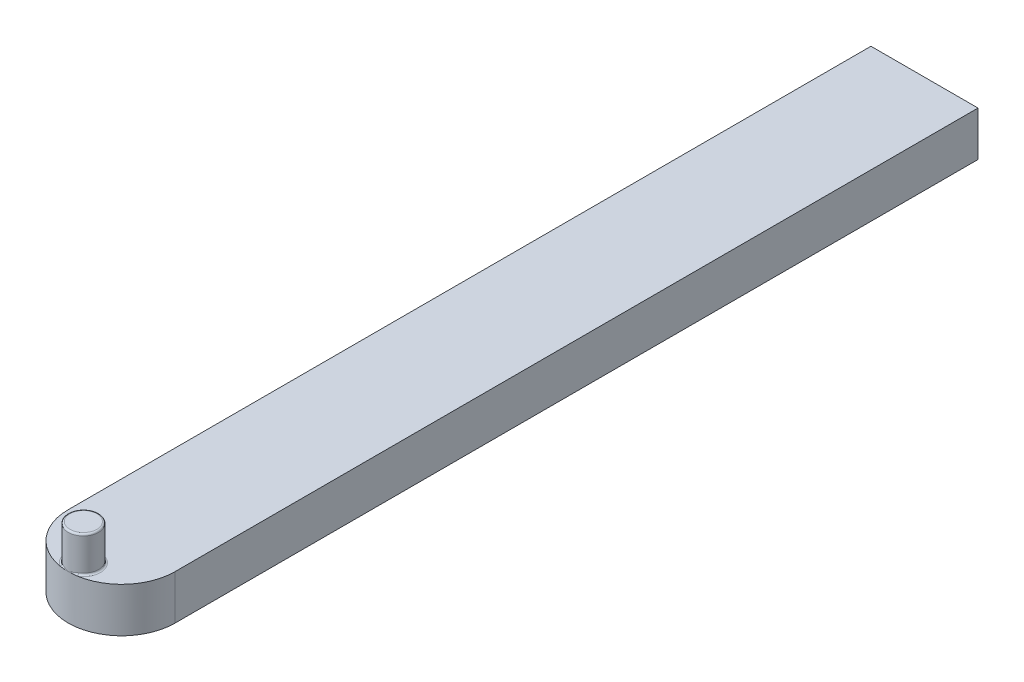
ISO-10303-21;
HEADER;
FILE_DESCRIPTION(('STEP AP214'),'2;1');
FILE_NAME('part.step','',(''),(''),'','','');
FILE_SCHEMA(('AUTOMOTIVE_DESIGN { 1 0 10303 214 1 1 1 1 }'));
ENDSEC;
DATA;
#1=APPLICATION_CONTEXT('core data for automotive mechanical design processes');
#2=APPLICATION_PROTOCOL_DEFINITION('international standard','automotive_design',2000,#1);
#3=PRODUCT_CONTEXT('',#1,'mechanical');
#4=PRODUCT('Part','Part','',(#3));
#5=PRODUCT_RELATED_PRODUCT_CATEGORY('part','',(#4));
#6=PRODUCT_DEFINITION_FORMATION('','',#4);
#7=PRODUCT_DEFINITION_CONTEXT('part definition',#1,'design');
#8=PRODUCT_DEFINITION('design','',#6,#7);
#9=PRODUCT_DEFINITION_SHAPE('','',#8);
#10=(LENGTH_UNIT() NAMED_UNIT(*) SI_UNIT(.MILLI.,.METRE.));
#11=(NAMED_UNIT(*) PLANE_ANGLE_UNIT() SI_UNIT($,.RADIAN.));
#12=(NAMED_UNIT(*) SI_UNIT($,.STERADIAN.) SOLID_ANGLE_UNIT());
#13=UNCERTAINTY_MEASURE_WITH_UNIT(LENGTH_MEASURE(1.E-05),#10,'distance_accuracy_value','');
#14=(GEOMETRIC_REPRESENTATION_CONTEXT(3) GLOBAL_UNCERTAINTY_ASSIGNED_CONTEXT((#13)) GLOBAL_UNIT_ASSIGNED_CONTEXT((#10,
#11,#12)) REPRESENTATION_CONTEXT('',''));
#15=CARTESIAN_POINT('',(0.,0.,0.));
#16=DIRECTION('',(0.,0.,1.));
#17=DIRECTION('',(1.,0.,0.));
#18=AXIS2_PLACEMENT_3D('',#15,#16,#17);
#19=CARTESIAN_POINT('',(0.,5.,0.));
#20=DIRECTION('',(0.,-1.,0.));
#21=DIRECTION('',(0.,0.,-1.));
#22=AXIS2_PLACEMENT_3D('',#19,#20,#21);
#23=CYLINDRICAL_SURFACE('',#22,6.);
#24=CARTESIAN_POINT('',(0.,0.,0.));
#25=DIRECTION('',(0.,1.,0.));
#26=DIRECTION('',(0.,0.,1.));
#27=AXIS2_PLACEMENT_3D('',#24,#25,#26);
#28=CIRCLE('',#27,6.);
#29=CARTESIAN_POINT('',(-6.,0.,0.));
#30=VERTEX_POINT('',#29);
#31=CARTESIAN_POINT('',(6.,0.,0.));
#32=VERTEX_POINT('',#31);
#33=EDGE_CURVE('E240',#30,#32,#28,.T.);
#34=ORIENTED_EDGE('',*,*,#33,.T.);
#35=DIRECTION('',(0.,-1.,0.));
#36=VECTOR('',#35,1.);
#37=CARTESIAN_POINT('',(6.,5.,0.));
#38=LINE('',#37,#36);
#39=CARTESIAN_POINT('',(6.,5.,0.));
#40=VERTEX_POINT('',#39);
#41=EDGE_CURVE('E218',#40,#32,#38,.T.);
#42=ORIENTED_EDGE('',*,*,#41,.F.);
#43=CARTESIAN_POINT('',(0.,5.,0.));
#44=DIRECTION('',(0.,1.,0.));
#45=DIRECTION('',(0.,0.,1.));
#46=AXIS2_PLACEMENT_3D('',#43,#44,#45);
#47=CIRCLE('',#46,6.);
#48=CARTESIAN_POINT('',(1.00376067843676,5.,5.91544288286382));
#49=VERTEX_POINT('',#48);
#50=EDGE_CURVE('E119',#49,#40,#47,.T.);
#51=ORIENTED_EDGE('',*,*,#50,.F.);
#52=CARTESIAN_POINT('',(0.,5.,6.));
#53=VERTEX_POINT('',#52);
#54=EDGE_CURVE('E120',#53,#49,#47,.T.);
#55=ORIENTED_EDGE('',*,*,#54,.F.);
#56=CARTESIAN_POINT('',(-1.00376067843676,5.,5.91544288286382));
#57=VERTEX_POINT('',#56);
#58=EDGE_CURVE('E66',#57,#53,#47,.T.);
#59=ORIENTED_EDGE('',*,*,#58,.F.);
#60=CARTESIAN_POINT('',(-6.,5.,0.));
#61=VERTEX_POINT('',#60);
#62=EDGE_CURVE('E121',#61,#57,#47,.T.);
#63=ORIENTED_EDGE('',*,*,#62,.F.);
#64=DIRECTION('',(0.,-1.,0.));
#65=VECTOR('',#64,1.);
#66=CARTESIAN_POINT('',(-6.,5.,0.));
#67=LINE('',#66,#65);
#68=EDGE_CURVE('E227',#61,#30,#67,.T.);
#69=ORIENTED_EDGE('',*,*,#68,.T.);
#70=EDGE_LOOP('',(#34,#42,#51,#55,#59,#63,#69));
#71=FACE_BOUND('',#70,.T.);
#72=ADVANCED_FACE('F41',(#71),#23,.T.);
#73=CARTESIAN_POINT('',(6.,5.,0.));
#74=DIRECTION('',(-1.,0.,0.));
#75=DIRECTION('',(0.,0.,1.));
#76=AXIS2_PLACEMENT_3D('',#73,#74,#75);
#77=PLANE('',#76);
#78=DIRECTION('',(0.,0.,-1.));
#79=VECTOR('',#78,1.);
#80=CARTESIAN_POINT('',(6.,0.,0.));
#81=LINE('',#80,#79);
#82=CARTESIAN_POINT('',(6.,0.,-90.));
#83=VERTEX_POINT('',#82);
#84=EDGE_CURVE('E232',#32,#83,#81,.T.);
#85=ORIENTED_EDGE('',*,*,#84,.T.);
#86=DIRECTION('',(0.,-1.,0.));
#87=VECTOR('',#86,1.);
#88=CARTESIAN_POINT('',(6.,5.,-90.));
#89=LINE('',#88,#87);
#90=CARTESIAN_POINT('',(6.,5.,-90.));
#91=VERTEX_POINT('',#90);
#92=EDGE_CURVE('E217',#91,#83,#89,.T.);
#93=ORIENTED_EDGE('',*,*,#92,.F.);
#94=DIRECTION('',(0.,0.,-1.));
#95=VECTOR('',#94,1.);
#96=CARTESIAN_POINT('',(6.,5.,0.));
#97=LINE('',#96,#95);
#98=EDGE_CURVE('E243',#40,#91,#97,.T.);
#99=ORIENTED_EDGE('',*,*,#98,.F.);
#100=ORIENTED_EDGE('',*,*,#41,.T.);
#101=EDGE_LOOP('',(#85,#93,#99,#100));
#102=FACE_BOUND('',#101,.T.);
#103=ADVANCED_FACE('F167',(#102),#77,.F.);
#104=CARTESIAN_POINT('',(-6.,5.,-90.));
#105=DIRECTION('',(0.,0.,1.));
#106=DIRECTION('',(1.,0.,0.));
#107=AXIS2_PLACEMENT_3D('',#104,#105,#106);
#108=PLANE('',#107);
#109=CARTESIAN_POINT('',(0.,2.5,-90.));
#110=DIRECTION('',(0.,0.,-1.));
#111=DIRECTION('',(-1.,0.,0.));
#112=AXIS2_PLACEMENT_3D('',#109,#110,#111);
#113=CIRCLE('',#112,1.95);
#114=CARTESIAN_POINT('',(-1.95,2.5,-90.));
#115=VERTEX_POINT('',#114);
#116=EDGE_CURVE('E183',#115,#115,#113,.T.);
#117=ORIENTED_EDGE('',*,*,#116,.F.);
#118=EDGE_LOOP('',(#117));
#119=FACE_BOUND('',#118,.T.);
#120=DIRECTION('',(-1.,0.,0.));
#121=VECTOR('',#120,1.);
#122=CARTESIAN_POINT('',(-6.,0.,-90.));
#123=LINE('',#122,#121);
#124=CARTESIAN_POINT('',(-6.,0.,-90.));
#125=VERTEX_POINT('',#124);
#126=EDGE_CURVE('E231',#83,#125,#123,.T.);
#127=ORIENTED_EDGE('',*,*,#126,.T.);
#128=DIRECTION('',(0.,-1.,0.));
#129=VECTOR('',#128,1.);
#130=CARTESIAN_POINT('',(-6.,5.,-90.));
#131=LINE('',#130,#129);
#132=CARTESIAN_POINT('',(-6.,5.,-90.));
#133=VERTEX_POINT('',#132);
#134=EDGE_CURVE('E224',#133,#125,#131,.T.);
#135=ORIENTED_EDGE('',*,*,#134,.F.);
#136=DIRECTION('',(-1.,0.,0.));
#137=VECTOR('',#136,1.);
#138=CARTESIAN_POINT('',(-6.,5.,-90.));
#139=LINE('',#138,#137);
#140=EDGE_CURVE('E241',#91,#133,#139,.T.);
#141=ORIENTED_EDGE('',*,*,#140,.F.);
#142=ORIENTED_EDGE('',*,*,#92,.T.);
#143=EDGE_LOOP('',(#127,#135,#141,#142));
#144=FACE_BOUND('',#143,.T.);
#145=ADVANCED_FACE('F260',(#119,#144),#108,.F.);
#146=CARTESIAN_POINT('',(-6.,5.,0.));
#147=DIRECTION('',(1.,0.,0.));
#148=DIRECTION('',(0.,0.,-1.));
#149=AXIS2_PLACEMENT_3D('',#146,#147,#148);
#150=PLANE('',#149);
#151=DIRECTION('',(0.,0.,1.));
#152=VECTOR('',#151,1.);
#153=CARTESIAN_POINT('',(-6.,0.,0.));
#154=LINE('',#153,#152);
#155=EDGE_CURVE('E233',#125,#30,#154,.T.);
#156=ORIENTED_EDGE('',*,*,#155,.T.);
#157=ORIENTED_EDGE('',*,*,#68,.F.);
#158=DIRECTION('',(0.,0.,1.));
#159=VECTOR('',#158,1.);
#160=CARTESIAN_POINT('',(-6.,5.,0.));
#161=LINE('',#160,#159);
#162=EDGE_CURVE('E229',#133,#61,#161,.T.);
#163=ORIENTED_EDGE('',*,*,#162,.F.);
#164=ORIENTED_EDGE('',*,*,#134,.T.);
#165=EDGE_LOOP('',(#156,#157,#163,#164));
#166=FACE_BOUND('',#165,.T.);
#167=ADVANCED_FACE('F258',(#166),#150,.F.);
#168=CARTESIAN_POINT('',(0.,5.,0.));
#169=DIRECTION('',(0.,1.,0.));
#170=DIRECTION('',(0.,0.,1.));
#171=AXIS2_PLACEMENT_3D('',#168,#169,#170);
#172=PLANE('',#171);
#173=ORIENTED_EDGE('',*,*,#62,.T.);
#174=CARTESIAN_POINT('',(0.,5.,4.28736421101754));
#175=DIRECTION('',(0.,1.,0.));
#176=DIRECTION('',(0.,0.,1.));
#177=AXIS2_PLACEMENT_3D('',#174,#175,#176);
#178=CIRCLE('',#177,1.91263578898246);
#179=EDGE_CURVE('E54',#57,#49,#178,.F.);
#180=ORIENTED_EDGE('',*,*,#179,.T.);
#181=ORIENTED_EDGE('',*,*,#50,.T.);
#182=ORIENTED_EDGE('',*,*,#98,.T.);
#183=ORIENTED_EDGE('',*,*,#140,.T.);
#184=ORIENTED_EDGE('',*,*,#162,.T.);
#185=EDGE_LOOP('',(#173,#180,#181,#182,#183,#184));
#186=FACE_BOUND('',#185,.T.);
#187=ADVANCED_FACE('F177',(#186),#172,.T.);
#188=CARTESIAN_POINT('',(0.,0.,0.));
#189=DIRECTION('',(0.,1.,0.));
#190=DIRECTION('',(0.,0.,1.));
#191=AXIS2_PLACEMENT_3D('',#188,#189,#190);
#192=PLANE('',#191);
#193=ORIENTED_EDGE('',*,*,#33,.F.);
#194=ORIENTED_EDGE('',*,*,#155,.F.);
#195=ORIENTED_EDGE('',*,*,#126,.F.);
#196=ORIENTED_EDGE('',*,*,#84,.F.);
#197=EDGE_LOOP('',(#193,#194,#195,#196));
#198=FACE_BOUND('',#197,.T.);
#199=ADVANCED_FACE('F251',(#198),#192,.F.);
#200=CARTESIAN_POINT('',(0.,2.5,-86.2));
#201=DIRECTION('',(0.,0.,-1.));
#202=DIRECTION('',(-1.,0.,0.));
#203=AXIS2_PLACEMENT_3D('',#200,#201,#202);
#204=CYLINDRICAL_SURFACE('',#203,1.95);
#205=CARTESIAN_POINT('',(0.,2.5,-86.2));
#206=DIRECTION('',(0.,0.,-1.));
#207=DIRECTION('',(-1.,0.,0.));
#208=AXIS2_PLACEMENT_3D('',#205,#206,#207);
#209=CIRCLE('',#208,1.95);
#210=CARTESIAN_POINT('',(-1.95,2.5,-86.2));
#211=VERTEX_POINT('',#210);
#212=EDGE_CURVE('E237',#211,#211,#209,.T.);
#213=CARTESIAN_POINT('',(-1.95,2.5,-86.2));
#214=CARTESIAN_POINT('',(-1.95,2.5,-86.2395833333333));
#215=CARTESIAN_POINT('',(-1.95,2.5,-86.2791666666667));
#216=CARTESIAN_POINT('',(-1.95,2.5,-86.3583333333333));
#217=CARTESIAN_POINT('',(-1.95,2.5,-86.3979166666667));
#218=CARTESIAN_POINT('',(-1.95,2.5,-86.4770833333333));
#219=CARTESIAN_POINT('',(-1.95,2.5,-86.5166666666667));
#220=CARTESIAN_POINT('',(-1.95,2.5,-86.5958333333333));
#221=CARTESIAN_POINT('',(-1.95,2.5,-86.6354166666667));
#222=CARTESIAN_POINT('',(-1.95,2.5,-86.7145833333333));
#223=CARTESIAN_POINT('',(-1.95,2.5,-86.7541666666667));
#224=CARTESIAN_POINT('',(-1.95,2.5,-86.8333333333333));
#225=CARTESIAN_POINT('',(-1.95,2.5,-86.8729166666667));
#226=CARTESIAN_POINT('',(-1.95,2.5,-86.9520833333333));
#227=CARTESIAN_POINT('',(-1.95,2.5,-86.9916666666667));
#228=CARTESIAN_POINT('',(-1.95,2.5,-87.0708333333333));
#229=CARTESIAN_POINT('',(-1.95,2.5,-87.1104166666667));
#230=CARTESIAN_POINT('',(-1.95,2.5,-87.1895833333333));
#231=CARTESIAN_POINT('',(-1.95,2.5,-87.2291666666667));
#232=CARTESIAN_POINT('',(-1.95,2.5,-87.3083333333333));
#233=CARTESIAN_POINT('',(-1.95,2.5,-87.3479166666667));
#234=CARTESIAN_POINT('',(-1.95,2.5,-87.4270833333333));
#235=CARTESIAN_POINT('',(-1.95,2.5,-87.4666666666667));
#236=CARTESIAN_POINT('',(-1.95,2.5,-87.5458333333333));
#237=CARTESIAN_POINT('',(-1.95,2.5,-87.5854166666667));
#238=CARTESIAN_POINT('',(-1.95,2.5,-87.6645833333333));
#239=CARTESIAN_POINT('',(-1.95,2.5,-87.7041666666667));
#240=CARTESIAN_POINT('',(-1.95,2.5,-87.7833333333333));
#241=CARTESIAN_POINT('',(-1.95,2.5,-87.8229166666667));
#242=CARTESIAN_POINT('',(-1.95,2.5,-87.9020833333333));
#243=CARTESIAN_POINT('',(-1.95,2.5,-87.9416666666667));
#244=CARTESIAN_POINT('',(-1.95,2.5,-88.0208333333333));
#245=CARTESIAN_POINT('',(-1.95,2.5,-88.0604166666667));
#246=CARTESIAN_POINT('',(-1.95,2.5,-88.1395833333333));
#247=CARTESIAN_POINT('',(-1.95,2.5,-88.1791666666667));
#248=CARTESIAN_POINT('',(-1.95,2.5,-88.2583333333333));
#249=CARTESIAN_POINT('',(-1.95,2.5,-88.2979166666667));
#250=CARTESIAN_POINT('',(-1.95,2.5,-88.3770833333333));
#251=CARTESIAN_POINT('',(-1.95,2.5,-88.4166666666667));
#252=CARTESIAN_POINT('',(-1.95,2.5,-88.4958333333333));
#253=CARTESIAN_POINT('',(-1.95,2.5,-88.5354166666667));
#254=CARTESIAN_POINT('',(-1.95,2.5,-88.6145833333333));
#255=CARTESIAN_POINT('',(-1.95,2.5,-88.6541666666667));
#256=CARTESIAN_POINT('',(-1.95,2.5,-88.7333333333333));
#257=CARTESIAN_POINT('',(-1.95,2.5,-88.7729166666667));
#258=CARTESIAN_POINT('',(-1.95,2.5,-88.8520833333333));
#259=CARTESIAN_POINT('',(-1.95,2.5,-88.8916666666667));
#260=CARTESIAN_POINT('',(-1.95,2.5,-88.9708333333333));
#261=CARTESIAN_POINT('',(-1.95,2.5,-89.0104166666667));
#262=CARTESIAN_POINT('',(-1.95,2.5,-89.0895833333333));
#263=CARTESIAN_POINT('',(-1.95,2.5,-89.1291666666667));
#264=CARTESIAN_POINT('',(-1.95,2.5,-89.2083333333333));
#265=CARTESIAN_POINT('',(-1.95,2.5,-89.2479166666667));
#266=CARTESIAN_POINT('',(-1.95,2.5,-89.3270833333333));
#267=CARTESIAN_POINT('',(-1.95,2.5,-89.3666666666667));
#268=CARTESIAN_POINT('',(-1.95,2.5,-89.4458333333333));
#269=CARTESIAN_POINT('',(-1.95,2.5,-89.4854166666667));
#270=CARTESIAN_POINT('',(-1.95,2.5,-89.5645833333333));
#271=CARTESIAN_POINT('',(-1.95,2.5,-89.6041666666667));
#272=CARTESIAN_POINT('',(-1.95,2.5,-89.6833333333333));
#273=CARTESIAN_POINT('',(-1.95,2.5,-89.7229166666667));
#274=CARTESIAN_POINT('',(-1.95,2.5,-89.8020833333333));
#275=CARTESIAN_POINT('',(-1.95,2.5,-89.8416666666667));
#276=CARTESIAN_POINT('',(-1.95,2.5,-89.9208333333333));
#277=CARTESIAN_POINT('',(-1.95,2.5,-89.9604166666667));
#278=CARTESIAN_POINT('',(-1.95,2.5,-90.));
#279=B_SPLINE_CURVE_WITH_KNOTS('',3,(#213,#214,#215,#216,#217,#218,#219,#220,#221,#222,#223,
#224,#225,#226,#227,#228,#229,#230,#231,#232,#233,#234,#235,#236,#237,#238,#239,#240,#241,#242,
#243,#244,#245,#246,#247,#248,#249,#250,#251,#252,#253,#254,#255,#256,#257,#258,#259,#260,#261,
#262,#263,#264,#265,#266,#267,#268,#269,#270,#271,#272,#273,#274,#275,#276,#277,#278),
.UNSPECIFIED.,.F.,.F.,(4,2,2,2,2,2,2,2,2,2,2,2,2,2,2,2,2,2,2,2,2,2,2,2,2,2,2,2,2,2,2,2,4),(0.,
0.118750000000001,0.237500000000002,0.356250000000002,0.475000000000003,0.593750000000004,
0.712500000000005,0.831250000000006,0.950000000000006,1.06875000000001,1.18750000000001,
1.30625000000001,1.42500000000001,1.54375000000001,1.66250000000001,1.78125000000001,1.9,
2.01875,2.1375,2.25625,2.375,2.49375,2.6125,2.73125,2.85000000000001,2.96875000000001,
3.08750000000001,3.20625000000001,3.32500000000001,3.44375000000001,3.56250000000001,
3.68125000000001,3.8),.UNSPECIFIED.);
#280=EDGE_CURVE('BSEAM252',#211,#115,#279,.T.);
#281=ORIENTED_EDGE('',*,*,#212,.F.);
#282=ORIENTED_EDGE('',*,*,#116,.T.);
#283=ORIENTED_EDGE('',*,*,#280,.T.);
#284=ORIENTED_EDGE('',*,*,#280,.F.);
#285=EDGE_LOOP('',(#281,#283,#282,#284));
#286=FACE_BOUND('',#285,.T.);
#287=ADVANCED_FACE('F252',(#286),#204,.F.);
#288=CARTESIAN_POINT('',(0.,2.5,-86.2));
#289=DIRECTION('',(0.,0.,-1.));
#290=DIRECTION('',(-1.,0.,0.));
#291=AXIS2_PLACEMENT_3D('',#288,#289,#290);
#292=PLANE('',#291);
#293=ORIENTED_EDGE('',*,*,#212,.T.);
#294=EDGE_LOOP('',(#293));
#295=FACE_BOUND('',#294,.T.);
#296=ADVANCED_FACE('F147',(#295),#292,.T.);
#297=CARTESIAN_POINT('',(0.,9.,4.28736421101754));
#298=DIRECTION('',(0.,-1.,0.));
#299=DIRECTION('',(0.,0.,-1.));
#300=AXIS2_PLACEMENT_3D('',#297,#298,#299);
#301=CYLINDRICAL_SURFACE('',#300,1.71263578898246);
#302=CARTESIAN_POINT('',(0.,8.8,4.28736421101754));
#303=DIRECTION('',(0.,1.,0.));
#304=DIRECTION('',(0.,0.,1.));
#305=AXIS2_PLACEMENT_3D('',#302,#303,#304);
#306=CIRCLE('',#305,1.71263578898246);
#307=CARTESIAN_POINT('',(0.,8.8,6.));
#308=VERTEX_POINT('',#307);
#309=EDGE_CURVE('E112',#308,#308,#306,.F.);
#310=ORIENTED_EDGE('',*,*,#309,.T.);
#311=EDGE_LOOP('',(#310));
#312=FACE_BOUND('',#311,.T.);
#313=CARTESIAN_POINT('',(-1.10362027494016,5.16040876764696,5.596999135126));
#314=CARTESIAN_POINT('',(-1.07392393181936,5.04940916337383,5.62202403768197));
#315=CARTESIAN_POINT('',(-1.12570605823589,4.99544261039352,5.71277233372481));
#316=CARTESIAN_POINT('',(-1.17748818465243,4.94147605741321,5.80352062976766));
#317=CARTESIAN_POINT('',(-1.2575361103215,5.,5.86673699182412));
#318=CARTESIAN_POINT('',(-1.09236767903783,5.16613691793417,5.60648476366702));
#319=CARTESIAN_POINT('',(-1.06609376265226,5.0562036384633,5.6281967895018));
#320=CARTESIAN_POINT('',(-1.11616543940341,5.00095368428733,5.71582240875919));
#321=CARTESIAN_POINT('',(-1.16635032887941,4.94564245760393,5.80340407462128));
#322=CARTESIAN_POINT('',(-1.24306167825842,5.,5.86984027051001));
#323=CARTESIAN_POINT('',(-1.08081503984888,5.17103730845206,5.61596884417271));
#324=CARTESIAN_POINT('',(-1.05746016137668,5.06250200209808,5.63493180941205));
#325=CARTESIAN_POINT('',(-1.10595483210957,5.00621520048697,5.71954045888801));
#326=CARTESIAN_POINT('',(-1.15455884848972,4.9498783775998,5.80410468076141));
#327=CARTESIAN_POINT('',(-1.22830767745949,5.,5.87294607745665));
#328=CARTESIAN_POINT('',(-1.057244836358,5.17944543409537,5.63479869554544));
#329=CARTESIAN_POINT('',(-1.03902498366968,5.07402302198039,5.6490554788838));
#330=CARTESIAN_POINT('',(-1.08452404787104,5.01613304891357,5.72790672150635));
#331=CARTESIAN_POINT('',(-1.13012743299175,4.9581942225549,5.80671895809463));
#332=CARTESIAN_POINT('',(-1.19841695463226,5.,5.87911789320462));
#333=CARTESIAN_POINT('',(-1.04522844021563,5.1829564459702,5.64414474118607));
#334=CARTESIAN_POINT('',(-1.02922928122045,5.0792640294631,5.65644256983822));
#335=CARTESIAN_POINT('',(-1.07330632380237,5.02079078743285,5.7325527060794));
#336=CARTESIAN_POINT('',(-1.11748675208457,4.9622798261696,5.80861902137721));
#337=CARTESIAN_POINT('',(-1.1832812237419,5.,5.88218397894993));
#338=CARTESIAN_POINT('',(-1.00881527904929,5.19178023438354,5.67168117201824));
#339=CARTESIAN_POINT('',(-0.998853576341289,5.09330260353681,5.67882559761961));
#340=CARTESIAN_POINT('',(-1.03876354670034,5.03366264157792,5.74721905756219));
#341=CARTESIAN_POINT('',(-1.07907664051996,4.9738708848786,5.81544121033621));
#342=CARTESIAN_POINT('',(-1.13772513934172,5.,5.89122516721697));
#343=CARTESIAN_POINT('',(-0.983855547876337,5.19547347846402,5.68953827010493));
#344=CARTESIAN_POINT('',(-0.976864897613683,5.10073098929437,5.69438149558876));
#345=CARTESIAN_POINT('',(-1.01437268252245,5.04087413383238,5.75803454128344));
#346=CARTESIAN_POINT('',(-1.0522448487405,4.98092988089751,5.82152877680651));
#347=CARTESIAN_POINT('',(-1.10689986091937,5.,5.89709832189816));
#348=CARTESIAN_POINT('',(-0.933568036833873,5.19970878559658,5.72349469726827));
#349=CARTESIAN_POINT('',(-0.931371736194212,5.11213465037369,5.72485949332842));
#350=CARTESIAN_POINT('',(-0.964538977626394,5.05268939312958,5.7799491810919));
#351=CARTESIAN_POINT('',(-0.998049115002479,4.99316380205146,5.83488670733428));
#352=CARTESIAN_POINT('',(-1.04554099896065,5.,5.90828176070843));
#353=CARTESIAN_POINT('',(-0.908267345192504,5.20033142335578,5.73962797406416));
#354=CARTESIAN_POINT('',(-0.90790496794933,5.11625119980216,5.73982118207356));
#355=CARTESIAN_POINT('',(-0.939140874968951,5.05735694603285,5.7910333225342));
#356=CARTESIAN_POINT('',(-0.970680019572279,4.99841870149489,5.84211698814717));
#357=CARTESIAN_POINT('',(-1.01502117949876,5.,5.91360280763719));
#358=CARTESIAN_POINT('',(-0.856871107528202,5.19935788037319,5.77053425345139));
#359=CARTESIAN_POINT('',(-0.859519940527553,5.12201432424907,5.76896586323772));
#360=CARTESIAN_POINT('',(-0.887175476502258,5.06474960853778,5.8130559549107));
#361=CARTESIAN_POINT('',(-0.91513038745246,5.00744314589011,5.85701913813502));
#362=CARTESIAN_POINT('',(-0.953662516896405,5.,5.92380757236332));
#363=CARTESIAN_POINT('',(-0.830775070187462,5.19776029977905,5.78530639157843));
#364=CARTESIAN_POINT('',(-0.83457123191753,5.12369320553082,5.78318513465672));
#365=CARTESIAN_POINT('',(-0.860607453285468,5.06747349101186,5.82399434955995));
#366=CARTESIAN_POINT('',(-0.88690561459026,5.01123742641692,5.8647004446845));
#367=CARTESIAN_POINT('',(-0.922823484663191,5.,5.92869101218141));
#368=CARTESIAN_POINT('',(-0.751152264431023,5.19036950634947,5.8276631948692));
#369=CARTESIAN_POINT('',(-0.758117175970833,5.12578682474698,5.82415996476509));
#370=CARTESIAN_POINT('',(-0.779224555127333,5.07326791496045,5.85608543365977));
#371=CARTESIAN_POINT('',(-0.801385242954253,5.02066944470644,5.88759522417409));
#372=CARTESIAN_POINT('',(-0.829583227203305,5.,5.94270627645453));
#373=CARTESIAN_POINT('',(-0.696646421069457,5.18196440429525,5.85304852301301));
#374=CARTESIAN_POINT('',(-0.704404062058612,5.1233295812667,5.84960054566621));
#375=CARTESIAN_POINT('',(-0.723088374176844,5.07388850271342,5.8763467991047));
#376=CARTESIAN_POINT('',(-0.742555205863136,5.02446965728288,5.90285071396167));
#377=CARTESIAN_POINT('',(-0.766891180697399,5.,5.95112397664384));
#378=CARTESIAN_POINT('',(-0.555950932817349,5.15517969930438,5.90986633918476));
#379=CARTESIAN_POINT('',(-0.565241798646122,5.11069862917963,5.90659211392553));
#380=CARTESIAN_POINT('',(-0.577765287088361,5.06998505513347,5.92260589136898));
#381=CARTESIAN_POINT('',(-0.592122543348691,5.02931889857513,5.93802572299684));
#382=CARTESIAN_POINT('',(-0.607273916849535,5.,5.96998519448999));
#383=CARTESIAN_POINT('',(-0.468555968109517,5.13386446408926,5.9371540500701));
#384=CARTESIAN_POINT('',(-0.476880500495286,5.09712739123847,5.93487394431689));
#385=CARTESIAN_POINT('',(-0.487110474221684,5.06249981603329,5.94578708372088));
#386=CARTESIAN_POINT('',(-0.498365581056978,5.02797042827561,5.95650591134503));
#387=CARTESIAN_POINT('',(-0.510156137855567,5.,5.97906544621832));
#388=CARTESIAN_POINT('',(-0.29187642975855,5.08651977508001,5.97736897751731));
#389=CARTESIAN_POINT('',(-0.297981988160502,5.06442725490788,5.97635937666229));
#390=CARTESIAN_POINT('',(-0.303605021504964,5.04251524296962,5.98024979808449));
#391=CARTESIAN_POINT('',(-0.310211975846502,5.0207236530867,5.9839572019686));
#392=CARTESIAN_POINT('',(-0.316094439649015,5.,5.9924553442687));
#393=CARTESIAN_POINT('',(-0.202598160789053,5.06050435287656,5.99033814153071));
#394=CARTESIAN_POINT('',(-0.206749955735045,5.04524217815681,5.98993799042956));
#395=CARTESIAN_POINT('',(-0.210761613949228,5.03003070212966,5.99156607449004));
#396=CARTESIAN_POINT('',(-0.215061937834043,5.01485844336741,5.99317002494692));
#397=CARTESIAN_POINT('',(-0.219150847714552,5.,5.99677892554685));
#398=CARTESIAN_POINT('',(-0.078452963435728,5.02355128238463,5.99855449952766));
#399=CARTESIAN_POINT('',(-0.0800554554302624,5.01766399812074,5.99849687297664));
#400=CARTESIAN_POINT('',(-0.0816202142198955,5.01177002326518,5.99873761716718));
#401=CARTESIAN_POINT('',(-0.0832271074592672,5.00588262435337,5.99897915146015));
#402=CARTESIAN_POINT('',(-0.0847929969148904,5.,5.99951808721551));
#403=CARTESIAN_POINT('',(-0.0437754830007874,5.01314540169326,5.99979170541662));
#404=CARTESIAN_POINT('',(-0.0446607432083171,5.00985909447385,5.99978337779282));
#405=CARTESIAN_POINT('',(-0.0455429716567191,5.00657224951168,5.99981804963728));
#406=CARTESIAN_POINT('',(-0.0464285853399877,5.00328593292899,5.99985282882923));
#407=CARTESIAN_POINT('',(-0.0473109047768812,5.,5.99993055569069));
#408=CARTESIAN_POINT('',(-0.00606358722998702,5.00182094493423,5.99999194625621));
#409=CARTESIAN_POINT('',(-0.00618601778418956,5.00136571248117,5.99999161303839));
#410=CARTESIAN_POINT('',(-0.0063084165081599,5.00091047479539,5.99999295965904));
#411=CARTESIAN_POINT('',(-0.00643084639361901,5.00045523812108,5.99999429543756));
#412=CARTESIAN_POINT('',(-0.0065532447142821,5.,5.9999973147518));
#413=CARTESIAN_POINT('',(-0.00303179343879855,5.00091047510353,5.99999999624849));
#414=CARTESIAN_POINT('',(-0.00309300386839634,5.00068285733357,5.99999998835596));
#415=CARTESIAN_POINT('',(-0.00315420779998162,5.00045524005438,5.99999999333612));
#416=CARTESIAN_POINT('',(-0.00321541696850603,5.00022761978578,5.9999999877497));
#417=CARTESIAN_POINT('',(-0.00327662102038141,5.,5.99999999863331));
#418=CARTESIAN_POINT('',(0.,5.,6.));
#419=CARTESIAN_POINT('',(4.54747343036706E-10,5.,6.));
#420=CARTESIAN_POINT('',(9.09494686073412E-10,5.,6.));
#421=CARTESIAN_POINT('',(1.36424202911012E-09,5.,6.));
#422=CARTESIAN_POINT('',(1.81898937214682E-09,5.,6.));
#423=(BOUNDED_SURFACE() B_SPLINE_SURFACE(3,2,((#313,#314,#315,#316,#317),(#318,#319,#320,#321,
#322),(#323,#324,#325,#326,#327),(#328,#329,#330,#331,#332),(#333,#334,#335,#336,#337),(#338,
#339,#340,#341,#342),(#343,#344,#345,#346,#347),(#348,#349,#350,#351,#352),(#353,#354,#355,#356,
#357),(#358,#359,#360,#361,#362),(#363,#364,#365,#366,#367),(#368,#369,#370,#371,#372),(#373,
#374,#375,#376,#377),(#378,#379,#380,#381,#382),(#383,#384,#385,#386,#387),(#388,#389,#390,#391,
#392),(#393,#394,#395,#396,#397),(#398,#399,#400,#401,#402),(#403,#404,#405,#406,#407),(#408,
#409,#410,#411,#412),(#413,#414,#415,#416,#417),(#418,#419,#420,#421,#422)),.UNSPECIFIED.,.F.,
.F.,.F.) B_SPLINE_SURFACE_WITH_KNOTS((4,2,2,2,2,2,2,2,2,2,4),(3,2,3),(0.,0.0521465496773101,
0.104169371856971,0.20731037791016,0.307729941711875,0.408212848993321,0.610600578509326,
0.922352298479436,1.2331882705487,1.35350667663893,1.36402504118299),(0.,0.5,1.),
.UNSPECIFIED.) GEOMETRIC_REPRESENTATION_ITEM() RATIONAL_B_SPLINE_SURFACE(((1.,0.862028681452386,
1.,0.862028681452386,1.),(1.,0.866851477096889,1.,0.866851477096889,1.),(1.,0.871435324877215,
1.,0.871435324877215,1.),(1.,0.880165921037607,1.,0.880165921037607,1.),(1.,0.884313680712764,
1.,0.884313680712764,1.),(1.,0.896127227876896,1.,0.896127227876896,1.),(1.,0.903245106314393,
1.,0.903245106314393,1.),(1.,0.916151732985931,1.,0.916151732985931,1.),(1.,0.921970595697205,
1.,0.921970595697205,1.),(1.,0.932724108082803,1.,0.932724108082803,1.),(1.,0.937658197690654,
1.,0.937658197690654,1.),(1.,0.951420268623527,1.,0.951420268623527,1.),(1.,0.959122522995934,
1.,0.959122522995934,1.),(1.,0.975836290574928,1.,0.975836290574928,1.),(1.,0.983306240979894,
1.,0.983306240979894,1.),(1.,0.994129488938435,1.,0.994129488938435,1.),(1.,0.997494814404702,
1.,0.997494814404702,1.),(1.,0.999625537991966,1.,0.999625537991966,1.),(1.,0.99994606861836,1.,
0.99994606861836,1.),(1.,0.999997918202139,1.,0.999997918202139,1.),(1.,1.00000000131101,1.,
1.00000000131101,1.),(1.,1.,1.,1.,1.))) REPRESENTATION_ITEM('') SURFACE());
#424=CARTESIAN_POINT('',(-1.10362027494016,5.16040876764696,5.596999135126));
#425=CARTESIAN_POINT('',(-1.09236767903783,5.16613691793417,5.60648476366702));
#426=CARTESIAN_POINT('',(-1.08081503984888,5.17103730845206,5.61596884417271));
#427=CARTESIAN_POINT('',(-1.057244836358,5.17944543409537,5.63479869554544));
#428=CARTESIAN_POINT('',(-1.04522844021563,5.1829564459702,5.64414474118607));
#429=CARTESIAN_POINT('',(-1.00881527904929,5.19178023438354,5.67168117201824));
#430=CARTESIAN_POINT('',(-0.983855547876337,5.19547347846402,5.68953827010493));
#431=CARTESIAN_POINT('',(-0.933568036833873,5.19970878559658,5.72349469726827));
#432=CARTESIAN_POINT('',(-0.908267345192504,5.20033142335578,5.73962797406416));
#433=CARTESIAN_POINT('',(-0.856871107528202,5.19935788037319,5.77053425345139));
#434=CARTESIAN_POINT('',(-0.830775070187462,5.19776029977905,5.78530639157843));
#435=CARTESIAN_POINT('',(-0.751152264431023,5.19036950634947,5.8276631948692));
#436=CARTESIAN_POINT('',(-0.696646421069457,5.18196440429525,5.85304852301301));
#437=CARTESIAN_POINT('',(-0.555950932817349,5.15517969930438,5.90986633918476));
#438=CARTESIAN_POINT('',(-0.468555968109517,5.13386446408926,5.9371540500701));
#439=CARTESIAN_POINT('',(-0.29187642975855,5.08651977508001,5.97736897751731));
#440=CARTESIAN_POINT('',(-0.202598160789053,5.06050435287656,5.99033814153071));
#441=CARTESIAN_POINT('',(-0.0784529634357281,5.02355128238463,5.99855449952766));
#442=CARTESIAN_POINT('',(-0.0437754830007878,5.01314540169326,5.99979170541662));
#443=CARTESIAN_POINT('',(-0.00606358722998702,5.00182094493423,5.99999194625621));
#444=CARTESIAN_POINT('',(-0.00303179343879856,5.00091047510353,5.99999999624849));
#445=CARTESIAN_POINT('',(0.,5.,6.));
#446=B_SPLINE_CURVE_WITH_KNOTS('',3,(#424,#425,#426,#427,#428,#429,#430,#431,#432,#433,#434,
#435,#436,#437,#438,#439,#440,#441,#442,#443,#444,#445),.UNSPECIFIED.,.F.,.F.,(4,2,2,2,2,2,2,2,
2,2,4),(0.,0.0521465496773101,0.104169371856971,0.20731037791016,0.307729941711875,
0.408212848993321,0.610600578509326,0.922352298479436,1.2331882705487,1.35350667663893,
1.36402504118299),.UNSPECIFIED.);
#447=CARTESIAN_POINT('',(-0.898799693787322,5.2,5.74519837722143));
#448=VERTEX_POINT('',#447);
#449=EDGE_CURVE('E102',#448,#53,#446,.T.);
#450=ORIENTED_EDGE('',*,*,#449,.T.);
#451=CARTESIAN_POINT('',(1.25753610671342,5.,5.86673699259751));
#452=CARTESIAN_POINT('',(1.17748818055168,4.94147605908745,5.80352063089182));
#453=CARTESIAN_POINT('',(1.12570605550435,4.99544261190589,5.71277233486091));
#454=CARTESIAN_POINT('',(1.07392393045702,5.04940916472433,5.62202403883));
#455=CARTESIAN_POINT('',(1.10362027494027,5.16040876764691,5.59699913512591));
#456=CARTESIAN_POINT('',(1.24306167693175,5.,5.86984027079432));
#457=CARTESIAN_POINT('',(1.1663503273856,4.94564245821396,5.8034040750328));
#458=CARTESIAN_POINT('',(1.11616543839896,5.00095368484334,5.71582240917699));
#459=CARTESIAN_POINT('',(1.06609376215872,5.05620363895311,5.62819678991792));
#460=CARTESIAN_POINT('',(1.0923676790391,5.16613691793353,5.60648476366594));
#461=CARTESIAN_POINT('',(1.22830767709925,5.,5.87294607753385));
#462=CARTESIAN_POINT('',(1.15455884808713,4.94987837776438,5.80410468087313));
#463=CARTESIAN_POINT('',(1.10595483183669,5.00621520063809,5.71954045900159));
#464=CARTESIAN_POINT('',(1.05746016124526,5.06250200222928,5.63493180952302));
#465=CARTESIAN_POINT('',(1.08081503985138,5.171037308451,5.61596884417066));
#466=CARTESIAN_POINT('',(1.19841695500108,5.,5.87911789312565));
#467=CARTESIAN_POINT('',(1.13012743339344,4.95819422239096,5.80671895798386));
#468=CARTESIAN_POINT('',(1.08452404815005,5.01613304875966,5.7279067213904));
#469=CARTESIAN_POINT('',(1.03902498380257,5.07402302184887,5.64905547877183));
#470=CARTESIAN_POINT('',(1.05724483636302,5.17944543409375,5.63479869554148));
#471=CARTESIAN_POINT('',(1.18328122387622,5.,5.8821839789213));
#472=CARTESIAN_POINT('',(1.11748675222807,4.96227982611153,5.80861902133814));
#473=CARTESIAN_POINT('',(1.07330632390387,5.0207907873776,5.73255270603724));
#474=CARTESIAN_POINT('',(1.02922928126982,5.07926402941594,5.65644256979699));
#475=CARTESIAN_POINT('',(1.04522844022196,5.18295644596841,5.64414474118117));
#476=CARTESIAN_POINT('',(1.13772513909803,5.,5.89122516726924));
#477=CARTESIAN_POINT('',(1.07907664026208,4.97387088498531,5.81544121040854));
#478=CARTESIAN_POINT('',(1.03876354651623,5.03366264168106,5.7472190576385));
#479=CARTESIAN_POINT('',(0.998853576262677,5.09330260362074,5.67882559768701));
#480=CARTESIAN_POINT('',(1.00881527905465,5.19178023438275,5.67168117201441));
#481=CARTESIAN_POINT('',(1.10689986085391,5.,5.89709832191171));
#482=CARTESIAN_POINT('',(1.05224484867282,4.98092988092508,5.82152877682494));
#483=CARTESIAN_POINT('',(1.01437268247379,5.04087413385944,5.75803454130303));
#484=CARTESIAN_POINT('',(0.976864897594234,5.100730989316,5.6943814956052));
#485=CARTESIAN_POINT('',(0.983855547879194,5.19547347846377,5.68953827010299));
#486=CARTESIAN_POINT('',(1.04554099902818,5.,5.90828176069454));
#487=CARTESIAN_POINT('',(0.998049115069434,4.99316380202456,5.83488670731609));
#488=CARTESIAN_POINT('',(0.964538977676845,5.05268939310249,5.77994918107147));
#489=CARTESIAN_POINT('',(0.931371736214522,5.11213465035252,5.72485949331154));
#490=CARTESIAN_POINT('',(0.933568036834148,5.19970878559657,5.72349469726809));
#491=CARTESIAN_POINT('',(1.01502117952697,5.,5.91360280763333));
#492=CARTESIAN_POINT('',(0.970680019598244,4.99841870148754,5.84211698814219));
#493=CARTESIAN_POINT('',(0.939140874987725,5.05735694602538,5.7910333225285));
#494=CARTESIAN_POINT('',(0.907904967957468,5.11625119979638,5.73982118206893));
#495=CARTESIAN_POINT('',(0.908267345192801,5.20033142335577,5.73962797406398));
#496=CARTESIAN_POINT('',(0.953662516868982,5.,5.92380757236705));
#497=CARTESIAN_POINT('',(0.915130387427879,5.00744314589719,5.85701913813965));
#498=CARTESIAN_POINT('',(0.887175476484146,5.06474960854516,5.81305595491612));
#499=CARTESIAN_POINT('',(0.859519940520446,5.12201432425467,5.76896586324173));
#500=CARTESIAN_POINT('',(0.856871107528545,5.1993578803732,5.77053425345119));
#501=CARTESIAN_POINT('',(0.922823484619477,5.,5.92869101218268));
#502=CARTESIAN_POINT('',(0.886905614554507,5.01123742641936,5.86470044468604));
#503=CARTESIAN_POINT('',(0.860607453262163,5.06747349101444,5.82399434956176));
#504=CARTESIAN_POINT('',(0.834571231906179,5.12369320553277,5.78318513465797));
#505=CARTESIAN_POINT('',(0.830775070187828,5.19776029977908,5.78530639157823));
#506=CARTESIAN_POINT('',(0.829583227292654,5.,5.94270627645177));
#507=CARTESIAN_POINT('',(0.801385243026008,5.0206694447015,5.88759522417083));
#508=CARTESIAN_POINT('',(0.779224555175428,5.07326791495517,5.85608543365566));
#509=CARTESIAN_POINT('',(0.758117175994101,5.12578682474308,5.82415996476222));
#510=CARTESIAN_POINT('',(0.751152264431457,5.19036950634953,5.82766319486899));
#511=CARTESIAN_POINT('',(0.76689118112085,5.,5.95112397664292));
#512=CARTESIAN_POINT('',(0.742555206194651,5.0244696572813,5.90285071396058));
#513=CARTESIAN_POINT('',(0.723088374389816,5.07388850271174,5.87634679910328));
#514=CARTESIAN_POINT('',(0.704404062169074,5.12332958126549,5.8496005456652));
#515=CARTESIAN_POINT('',(0.696646421069935,5.18196440429533,5.8530485230128));
#516=CARTESIAN_POINT('',(0.607273916198594,5.,5.96998519449126));
#517=CARTESIAN_POINT('',(0.592122542848386,5.02931889857747,5.93802572299812));
#518=CARTESIAN_POINT('',(0.577765286761565,5.0699850551361,5.92260589137077));
#519=CARTESIAN_POINT('',(0.565241798480434,5.11069862918161,5.90659211392643));
#520=CARTESIAN_POINT('',(0.55595093281791,5.15517969930451,5.90986633918457));
#521=CARTESIAN_POINT('',(0.510156134756946,5.,5.9790654462186));
#522=CARTESIAN_POINT('',(0.498365578693715,5.02797042827622,5.95650591134526));
#523=CARTESIAN_POINT('',(0.487110472672251,5.06249981603402,5.94578708372124));
#524=CARTESIAN_POINT('',(0.47688049970814,5.09712739123906,5.93487394431697));
#525=CARTESIAN_POINT('',(0.468555968110114,5.13386446408941,5.93715405006993));
#526=CARTESIAN_POINT('',(0.316094442740024,5.,5.99245534426832));
#527=CARTESIAN_POINT('',(0.310211978178479,5.02072365308614,5.98395720196819));
#528=CARTESIAN_POINT('',(0.30360502305121,5.04251524296903,5.98024979808388));
#529=CARTESIAN_POINT('',(0.297981988937986,5.06442725490751,5.97635937666193));
#530=CARTESIAN_POINT('',(0.291876429759215,5.0865197750802,5.9773689775172));
#531=CARTESIAN_POINT('',(0.21915085941033,5.,5.99677892554678));
#532=CARTESIAN_POINT('',(0.215061946628052,5.01485844336736,5.99317002494682));
#533=CARTESIAN_POINT('',(0.210761619797523,5.03003070212966,5.9915660744899));
#534=CARTESIAN_POINT('',(0.206749958666801,5.04524217815689,5.98993799042944));
#535=CARTESIAN_POINT('',(0.202598160789751,5.06050435287676,5.99033814153062));
#536=CARTESIAN_POINT('',(0.0847929923882629,5.,5.99951808721552));
#537=CARTESIAN_POINT('',(0.0832271040631603,5.00588262435344,5.99897915146016));
#538=CARTESIAN_POINT('',(0.0816202119568005,5.01177002326529,5.9987376171672));
#539=CARTESIAN_POINT('',(0.0800554542985697,5.01766399812088,5.99849687297664));
#540=CARTESIAN_POINT('',(0.0784529634362119,5.02355128238479,5.99855449952765));
#541=CARTESIAN_POINT('',(0.0473108926814546,5.,5.99993055569069));
#542=CARTESIAN_POINT('',(0.0464285762679897,5.00328593292901,5.99985282882923));
#543=CARTESIAN_POINT('',(0.0455429656091239,5.00657224951173,5.99981804963728));
#544=CARTESIAN_POINT('',(0.0446607401844794,5.00985909447392,5.99978337779282));
#545=CARTESIAN_POINT('',(0.0437754830010273,5.01314540169335,5.99979170541662));
#546=CARTESIAN_POINT('',(0.00655324577145162,5.,5.9999973147518));
#547=CARTESIAN_POINT('',(0.00643084718649755,5.00045523812108,5.99999429543756));
#548=CARTESIAN_POINT('',(0.00630841703674457,5.0009104747954,5.99999295965903));
#549=CARTESIAN_POINT('',(0.00618601804848192,5.00136571248117,5.99999161303839));
#550=CARTESIAN_POINT('',(0.00606358722998651,5.00182094493423,5.99999194625621));
#551=CARTESIAN_POINT('',(0.00327662328523012,5.,5.99999999863331));
#552=CARTESIAN_POINT('',(0.00321541866714238,5.00022761978578,5.9999999877497));
#553=CARTESIAN_POINT('',(0.00315420893240602,5.00045524005438,5.99999999333612));
#554=CARTESIAN_POINT('',(0.00309300443460811,5.00068285733357,5.99999998835596));
#555=CARTESIAN_POINT('',(0.00303179343879829,5.00091047510354,5.99999999624849));
#556=CARTESIAN_POINT('',(1.81898937214682E-09,5.,6.));
#557=CARTESIAN_POINT('',(1.36424202911012E-09,5.,6.));
#558=CARTESIAN_POINT('',(9.09494686073412E-10,5.,6.));
#559=CARTESIAN_POINT('',(4.54747343036706E-10,5.,6.));
#560=CARTESIAN_POINT('',(0.,5.,6.));
#561=(BOUNDED_SURFACE() B_SPLINE_SURFACE(3,2,((#451,#452,#453,#454,#455),(#456,#457,#458,#459,
#460),(#461,#462,#463,#464,#465),(#466,#467,#468,#469,#470),(#471,#472,#473,#474,#475),(#476,
#477,#478,#479,#480),(#481,#482,#483,#484,#485),(#486,#487,#488,#489,#490),(#491,#492,#493,#494,
#495),(#496,#497,#498,#499,#500),(#501,#502,#503,#504,#505),(#506,#507,#508,#509,#510),(#511,
#512,#513,#514,#515),(#516,#517,#518,#519,#520),(#521,#522,#523,#524,#525),(#526,#527,#528,#529,
#530),(#531,#532,#533,#534,#535),(#536,#537,#538,#539,#540),(#541,#542,#543,#544,#545),(#546,
#547,#548,#549,#550),(#551,#552,#553,#554,#555),(#556,#557,#558,#559,#560)),.UNSPECIFIED.,.F.,
.F.,.F.) B_SPLINE_SURFACE_WITH_KNOTS((4,2,2,2,2,2,2,2,2,2,4),(3,2,3),(0.,0.0521465496719435,
0.104169371846269,0.207310377909974,0.307729941711623,0.408212848992991,0.610600578508851,
0.922352298478857,1.23318827054802,1.3535066766391,1.36402504118315),(0.,0.5,1.),
.UNSPECIFIED.) GEOMETRIC_REPRESENTATION_ITEM() RATIONAL_B_SPLINE_SURFACE(((1.,0.862028682745046,
1.,0.862028682745046,1.),(1.,0.866851477572129,1.,0.866851477572129,1.),(1.,0.871435325006375,
1.,0.871435325006375,1.),(1.,0.880165920905997,1.,0.880165920905997,1.),(1.,0.88431368066544,1.,
0.88431368066544,1.),(1.,0.896127227964853,1.,0.896127227964853,1.),(1.,0.90324510633737,1.,
0.90324510633737,1.),(1.,0.916151732962762,1.,0.916151732962762,1.),(1.,0.921970595690799,1.,
0.921970595690799,1.),(1.,0.932724108089073,1.,0.932724108089073,1.),(1.,0.937658197692824,1.,
0.937658197692824,1.),(1.,0.951420268618963,1.,0.951420268618963,1.),(1.,0.959122522994438,1.,
0.959122522994438,1.),(1.,0.975836290577093,1.,0.975836290577093,1.),(1.,0.983306240980419,1.,
0.983306240980419,1.),(1.,0.994129488937829,1.,0.994129488937829,1.),(1.,0.9974948144046,1.,
0.9974948144046,1.),(1.,0.999625537991995,1.,0.999625537991995,1.),(1.,0.999946068618363,1.,
0.999946068618363,1.),(1.,0.999997918202139,1.,0.999997918202139,1.),(1.,1.00000000131101,1.,
1.00000000131101,1.),(1.,1.,1.,1.,1.))) REPRESENTATION_ITEM('') SURFACE());
#562=CARTESIAN_POINT('',(1.10362027494027,5.16040876764691,5.59699913512591));
#563=CARTESIAN_POINT('',(1.0923676790391,5.16613691793353,5.60648476366594));
#564=CARTESIAN_POINT('',(1.08081503985138,5.171037308451,5.61596884417066));
#565=CARTESIAN_POINT('',(1.05724483636302,5.17944543409375,5.63479869554148));
#566=CARTESIAN_POINT('',(1.04522844022196,5.18295644596841,5.64414474118117));
#567=CARTESIAN_POINT('',(1.00881527905465,5.19178023438275,5.67168117201441));
#568=CARTESIAN_POINT('',(0.983855547879194,5.19547347846378,5.68953827010299));
#569=CARTESIAN_POINT('',(0.933568036834148,5.19970878559657,5.7234946972681));
#570=CARTESIAN_POINT('',(0.908267345192801,5.20033142335577,5.73962797406398));
#571=CARTESIAN_POINT('',(0.856871107528545,5.1993578803732,5.77053425345119));
#572=CARTESIAN_POINT('',(0.830775070187828,5.19776029977908,5.78530639157823));
#573=CARTESIAN_POINT('',(0.751152264431457,5.19036950634953,5.82766319486899));
#574=CARTESIAN_POINT('',(0.696646421069935,5.18196440429533,5.8530485230128));
#575=CARTESIAN_POINT('',(0.55595093281791,5.15517969930451,5.90986633918457));
#576=CARTESIAN_POINT('',(0.468555968110114,5.13386446408941,5.93715405006993));
#577=CARTESIAN_POINT('',(0.291876429759215,5.0865197750802,5.9773689775172));
#578=CARTESIAN_POINT('',(0.202598160789751,5.06050435287676,5.99033814153062));
#579=CARTESIAN_POINT('',(0.078452963436212,5.02355128238479,5.99855449952765));
#580=CARTESIAN_POINT('',(0.0437754830010277,5.01314540169335,5.99979170541662));
#581=CARTESIAN_POINT('',(0.00606358722998651,5.00182094493423,5.99999194625621));
#582=CARTESIAN_POINT('',(0.00303179343879829,5.00091047510354,5.99999999624849));
#583=CARTESIAN_POINT('',(0.,5.,6.));
#584=B_SPLINE_CURVE_WITH_KNOTS('',3,(#562,#563,#564,#565,#566,#567,#568,#569,#570,#571,#572,
#573,#574,#575,#576,#577,#578,#579,#580,#581,#582,#583),.UNSPECIFIED.,.F.,.F.,(4,2,2,2,2,2,2,2,
2,2,4),(0.,0.0521465496719435,0.104169371846269,0.207310377909974,0.307729941711623,
0.408212848992991,0.610600578508851,0.922352298478857,1.23318827054802,1.3535066766391,
1.36402504118315),.UNSPECIFIED.);
#585=CARTESIAN_POINT('',(0.898799693787323,5.2,5.74519837722143));
#586=VERTEX_POINT('',#585);
#587=EDGE_CURVE('E108',#53,#586,#584,.F.);
#588=ORIENTED_EDGE('',*,*,#587,.T.);
#589=CARTESIAN_POINT('',(0.,5.2,4.28736421101754));
#590=DIRECTION('',(0.,1.,0.));
#591=DIRECTION('',(0.,0.,1.));
#592=AXIS2_PLACEMENT_3D('',#589,#590,#591);
#593=CIRCLE('',#592,1.71263578898246);
#594=EDGE_CURVE('E109',#586,#448,#593,.T.);
#595=ORIENTED_EDGE('',*,*,#594,.T.);
#596=EDGE_LOOP('',(#450,#588,#595));
#597=FACE_BOUND('',#596,.T.);
#598=ADVANCED_FACE('F106',(#312,#597),#301,.T.);
#599=CARTESIAN_POINT('',(0.,9.,4.28736421101754));
#600=DIRECTION('',(0.,1.,0.));
#601=DIRECTION('',(0.,0.,1.));
#602=AXIS2_PLACEMENT_3D('',#599,#600,#601);
#603=PLANE('',#602);
#604=CARTESIAN_POINT('',(0.,9.,4.28736421101754));
#605=DIRECTION('',(0.,1.,0.));
#606=DIRECTION('',(0.,0.,1.));
#607=AXIS2_PLACEMENT_3D('',#604,#605,#606);
#608=CIRCLE('',#607,1.51263578898246);
#609=CARTESIAN_POINT('',(0.,9.,5.8));
#610=VERTEX_POINT('',#609);
#611=EDGE_CURVE('E11',#610,#610,#608,.T.);
#612=ORIENTED_EDGE('',*,*,#611,.T.);
#613=EDGE_LOOP('',(#612));
#614=FACE_BOUND('',#613,.T.);
#615=ADVANCED_FACE('F143',(#614),#603,.T.);
#616=ORIENTED_EDGE('',*,*,#58,.T.);
#617=ORIENTED_EDGE('',*,*,#449,.F.);
#618=CARTESIAN_POINT('',(-1.00376067843676,5.2,5.91544288286382));
#619=DIRECTION('',(-0.851222528211934,0.,-0.524804923247184));
#620=DIRECTION('',(-0.524804923247184,0.,0.851222528211934));
#621=AXIS2_PLACEMENT_3D('',#618,#619,#620);
#622=CIRCLE('',#621,0.2);
#623=EDGE_CURVE('E127',#57,#448,#622,.F.);
#624=ORIENTED_EDGE('',*,*,#623,.F.);
#625=EDGE_LOOP('',(#616,#617,#624));
#626=FACE_BOUND('',#625,.T.);
#627=ADVANCED_FACE('F123',(#626),#423,.F.);
#628=CARTESIAN_POINT('',(0.,5.2,4.28736421101754));
#629=DIRECTION('',(0.,1.,0.));
#630=DIRECTION('',(0.,0.,1.));
#631=AXIS2_PLACEMENT_3D('',#628,#629,#630);
#632=TOROIDAL_SURFACE('',#631,1.91263578898246,0.2);
#633=ORIENTED_EDGE('',*,*,#623,.T.);
#634=ORIENTED_EDGE('',*,*,#594,.F.);
#635=CARTESIAN_POINT('',(1.00376067843676,5.2,5.91544288286382));
#636=DIRECTION('',(0.851222528211932,0.,-0.524804923247187));
#637=DIRECTION('',(-0.524804923247187,0.,-0.851222528211933));
#638=AXIS2_PLACEMENT_3D('',#635,#636,#637);
#639=CIRCLE('',#638,0.2);
#640=EDGE_CURVE('E129',#49,#586,#639,.T.);
#641=ORIENTED_EDGE('',*,*,#640,.F.);
#642=ORIENTED_EDGE('',*,*,#179,.F.);
#643=EDGE_LOOP('',(#633,#634,#641,#642));
#644=FACE_BOUND('',#643,.T.);
#645=ADVANCED_FACE('F193',(#644),#632,.F.);
#646=ORIENTED_EDGE('',*,*,#587,.F.);
#647=ORIENTED_EDGE('',*,*,#54,.T.);
#648=ORIENTED_EDGE('',*,*,#640,.T.);
#649=EDGE_LOOP('',(#646,#647,#648));
#650=FACE_BOUND('',#649,.T.);
#651=ADVANCED_FACE('F130',(#650),#561,.F.);
#652=CARTESIAN_POINT('',(0.,8.8,4.28736421101754));
#653=DIRECTION('',(0.,1.,0.));
#654=DIRECTION('',(0.,0.,1.));
#655=AXIS2_PLACEMENT_3D('',#652,#653,#654);
#656=TOROIDAL_SURFACE('',#655,1.51263578898246,0.2);
#657=ORIENTED_EDGE('',*,*,#309,.F.);
#658=EDGE_LOOP('',(#657));
#659=FACE_BOUND('',#658,.T.);
#660=ORIENTED_EDGE('',*,*,#611,.F.);
#661=EDGE_LOOP('',(#660));
#662=FACE_BOUND('',#661,.T.);
#663=ADVANCED_FACE('F43',(#659,#662),#656,.T.);
#664=CLOSED_SHELL('',(#72,#103,#145,#167,#187,#199,#287,#296,#598,#615,#627,#645,#651,#663));
#665=MANIFOLD_SOLID_BREP('B2',#664);
#666=ADVANCED_BREP_SHAPE_REPRESENTATION('',(#18,#665),#14);
#667=SHAPE_DEFINITION_REPRESENTATION(#9,#666);
ENDSEC;
END-ISO-10303-21;
